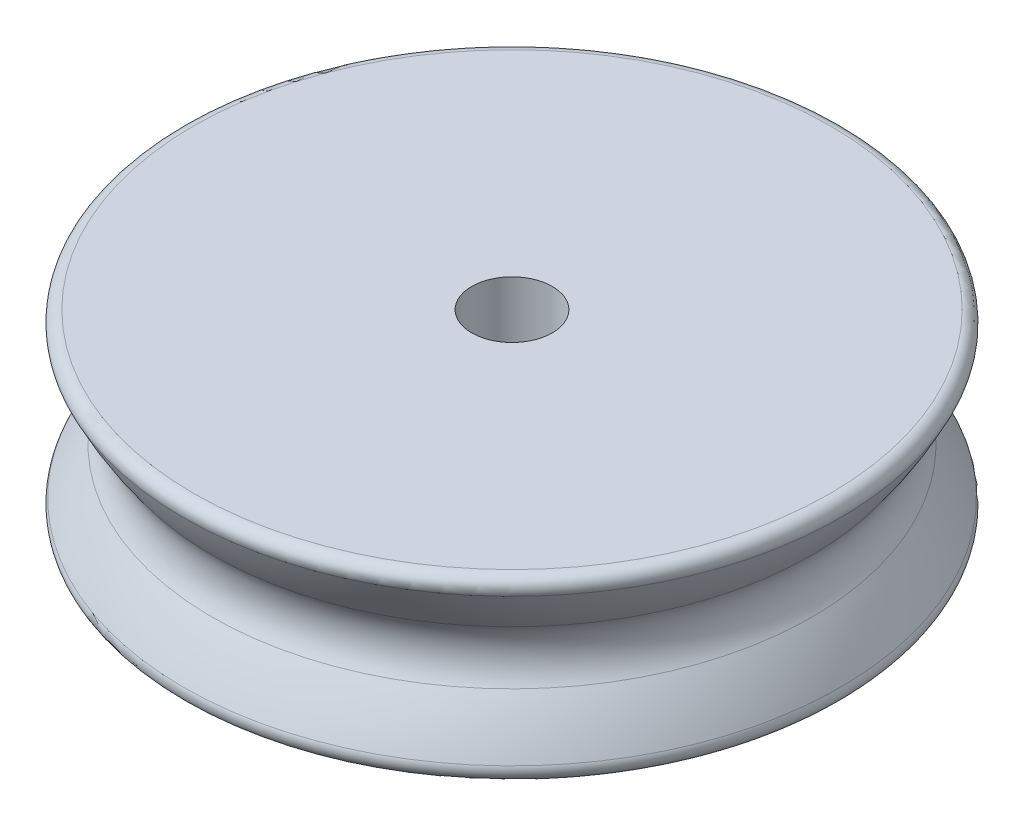
ISO-10303-21;
HEADER;
FILE_DESCRIPTION(('STEP AP214'),'2;1');
FILE_NAME('part.step','',(''),(''),'','','');
FILE_SCHEMA(('AUTOMOTIVE_DESIGN { 1 0 10303 214 1 1 1 1 }'));
ENDSEC;
DATA;
#1=APPLICATION_CONTEXT('core data for automotive mechanical design processes');
#2=APPLICATION_PROTOCOL_DEFINITION('international standard','automotive_design',2000,#1);
#3=PRODUCT_CONTEXT('',#1,'mechanical');
#4=PRODUCT('Part','Part','',(#3));
#5=PRODUCT_RELATED_PRODUCT_CATEGORY('part','',(#4));
#6=PRODUCT_DEFINITION_FORMATION('','',#4);
#7=PRODUCT_DEFINITION_CONTEXT('part definition',#1,'design');
#8=PRODUCT_DEFINITION('design','',#6,#7);
#9=PRODUCT_DEFINITION_SHAPE('','',#8);
#10=(LENGTH_UNIT() NAMED_UNIT(*) SI_UNIT(.MILLI.,.METRE.));
#11=(NAMED_UNIT(*) PLANE_ANGLE_UNIT() SI_UNIT($,.RADIAN.));
#12=(NAMED_UNIT(*) SI_UNIT($,.STERADIAN.) SOLID_ANGLE_UNIT());
#13=UNCERTAINTY_MEASURE_WITH_UNIT(LENGTH_MEASURE(1.E-05),#10,'distance_accuracy_value','');
#14=(GEOMETRIC_REPRESENTATION_CONTEXT(3) GLOBAL_UNCERTAINTY_ASSIGNED_CONTEXT((#13)) GLOBAL_UNIT_ASSIGNED_CONTEXT((#10,
#11,#12)) REPRESENTATION_CONTEXT('',''));
#15=CARTESIAN_POINT('',(0.,0.,0.));
#16=DIRECTION('',(0.,0.,1.));
#17=DIRECTION('',(1.,0.,0.));
#18=AXIS2_PLACEMENT_3D('',#15,#16,#17);
#19=CARTESIAN_POINT('',(2.286,5.08,0.));
#20=DIRECTION('',(0.,-1.,0.));
#21=DIRECTION('',(0.,0.,-1.));
#22=AXIS2_PLACEMENT_3D('',#19,#20,#21);
#23=PLANE('',#22);
#24=CARTESIAN_POINT('',(0.,5.08,0.));
#25=DIRECTION('',(0.,-1.,0.));
#26=DIRECTION('',(0.,0.,-1.));
#27=AXIS2_PLACEMENT_3D('',#24,#25,#26);
#28=CIRCLE('',#27,18.0657146436087);
#29=CARTESIAN_POINT('',(0.,5.08,-18.0657146436087));
#30=VERTEX_POINT('',#29);
#31=EDGE_CURVE('E47',#30,#30,#28,.F.);
#32=ORIENTED_EDGE('',*,*,#31,.T.);
#33=EDGE_LOOP('',(#32));
#34=FACE_BOUND('',#33,.T.);
#35=CARTESIAN_POINT('',(0.,5.08,0.));
#36=DIRECTION('',(0.,1.,0.));
#37=DIRECTION('',(0.,0.,1.));
#38=AXIS2_PLACEMENT_3D('',#35,#36,#37);
#39=CIRCLE('',#38,2.286);
#40=CARTESIAN_POINT('',(0.,5.08,2.286));
#41=VERTEX_POINT('',#40);
#42=EDGE_CURVE('E71',#41,#41,#39,.T.);
#43=ORIENTED_EDGE('',*,*,#42,.F.);
#44=EDGE_LOOP('',(#43));
#45=FACE_BOUND('',#44,.T.);
#46=ADVANCED_FACE('F39',(#34,#45),#23,.F.);
#47=CARTESIAN_POINT('',(0.,5.08,0.));
#48=DIRECTION('',(0.,1.,0.));
#49=DIRECTION('',(0.,0.,1.));
#50=AXIS2_PLACEMENT_3D('',#47,#48,#49);
#51=CYLINDRICAL_SURFACE('',#50,2.286);
#52=CARTESIAN_POINT('',(0.,-5.08,0.));
#53=DIRECTION('',(0.,1.,0.));
#54=DIRECTION('',(0.,0.,1.));
#55=AXIS2_PLACEMENT_3D('',#52,#53,#54);
#56=CIRCLE('',#55,2.286);
#57=CARTESIAN_POINT('',(0.,-5.08,2.286));
#58=VERTEX_POINT('',#57);
#59=EDGE_CURVE('E75',#58,#58,#56,.T.);
#60=ORIENTED_EDGE('',*,*,#59,.F.);
#61=EDGE_LOOP('',(#60));
#62=FACE_BOUND('',#61,.T.);
#63=ORIENTED_EDGE('',*,*,#42,.T.);
#64=EDGE_LOOP('',(#63));
#65=FACE_BOUND('',#64,.T.);
#66=ADVANCED_FACE('F82',(#62,#65),#51,.F.);
#67=CARTESIAN_POINT('',(2.286,-5.08,0.));
#68=DIRECTION('',(0.,1.,0.));
#69=DIRECTION('',(0.,0.,1.));
#70=AXIS2_PLACEMENT_3D('',#67,#68,#69);
#71=PLANE('',#70);
#72=CARTESIAN_POINT('',(0.,-5.08,0.));
#73=DIRECTION('',(0.,1.,0.));
#74=DIRECTION('',(0.,0.,1.));
#75=AXIS2_PLACEMENT_3D('',#72,#73,#74);
#76=CIRCLE('',#75,18.0657146436087);
#77=CARTESIAN_POINT('',(0.,-5.08,18.0657146436087));
#78=VERTEX_POINT('',#77);
#79=EDGE_CURVE('E52',#78,#78,#76,.F.);
#80=ORIENTED_EDGE('',*,*,#79,.T.);
#81=EDGE_LOOP('',(#80));
#82=FACE_BOUND('',#81,.T.);
#83=ORIENTED_EDGE('',*,*,#59,.T.);
#84=EDGE_LOOP('',(#83));
#85=FACE_BOUND('',#84,.T.);
#86=ADVANCED_FACE('F80',(#82,#85),#71,.F.);
#87=CARTESIAN_POINT('',(0.,0.,0.));
#88=DIRECTION('',(0.,1.,0.));
#89=DIRECTION('',(0.,0.,1.));
#90=AXIS2_PLACEMENT_3D('',#87,#88,#89);
#91=TOROIDAL_SURFACE('',#90,19.05,2.54);
#92=CARTESIAN_POINT('',(0.,-1.52400000000001,0.));
#93=DIRECTION('',(0.,1.,0.));
#94=DIRECTION('',(-1.,0.,0.));
#95=AXIS2_PLACEMENT_3D('',#92,#93,#94);
#96=CIRCLE('',#95,17.018);
#97=CARTESIAN_POINT('',(-17.018,-1.52400000000002,0.));
#98=VERTEX_POINT('',#97);
#99=EDGE_CURVE('E64',#98,#98,#96,.T.);
#100=ORIENTED_EDGE('',*,*,#99,.T.);
#101=EDGE_LOOP('',(#100));
#102=FACE_BOUND('',#101,.T.);
#103=CARTESIAN_POINT('',(0.,1.52399999999999,0.));
#104=DIRECTION('',(0.,-1.,0.));
#105=DIRECTION('',(1.,0.,0.));
#106=AXIS2_PLACEMENT_3D('',#103,#104,#105);
#107=CIRCLE('',#106,17.018);
#108=CARTESIAN_POINT('',(17.018,1.52399999999998,0.));
#109=VERTEX_POINT('',#108);
#110=EDGE_CURVE('E68',#109,#109,#107,.T.);
#111=ORIENTED_EDGE('',*,*,#110,.T.);
#112=EDGE_LOOP('',(#111));
#113=FACE_BOUND('',#112,.T.);
#114=ADVANCED_FACE('F98',(#102,#113),#91,.F.);
#115=CARTESIAN_POINT('',(0.,-11.43,0.));
#116=DIRECTION('',(0.,1.,0.));
#117=DIRECTION('',(-1.,0.,0.));
#118=AXIS2_PLACEMENT_3D('',#115,#116,#117);
#119=DEGENERATE_TOROIDAL_SURFACE('',#118,3.81000000000001,16.51,.T.);
#120=CARTESIAN_POINT('',(0.,-4.1656,0.));
#121=DIRECTION('',(0.,-1.,0.));
#122=DIRECTION('',(0.,0.,-1.));
#123=AXIS2_PLACEMENT_3D('',#120,#121,#122);
#124=CIRCLE('',#123,18.6359432293531);
#125=CARTESIAN_POINT('',(0.,-4.1656,-18.6359432293531));
#126=VERTEX_POINT('',#125);
#127=EDGE_CURVE('E58',#126,#126,#124,.F.);
#128=ORIENTED_EDGE('',*,*,#127,.T.);
#129=EDGE_LOOP('',(#128));
#130=FACE_BOUND('',#129,.T.);
#131=ORIENTED_EDGE('',*,*,#99,.F.);
#132=EDGE_LOOP('',(#131));
#133=FACE_BOUND('',#132,.T.);
#134=ADVANCED_FACE('F94',(#130,#133),#119,.T.);
#135=CARTESIAN_POINT('',(0.,11.43,0.));
#136=DIRECTION('',(0.,1.,0.));
#137=DIRECTION('',(-1.,0.,0.));
#138=AXIS2_PLACEMENT_3D('',#135,#136,#137);
#139=DEGENERATE_TOROIDAL_SURFACE('',#138,3.81000000000001,16.51,.T.);
#140=CARTESIAN_POINT('',(0.,4.1656,0.));
#141=DIRECTION('',(0.,1.,0.));
#142=DIRECTION('',(0.,0.,1.));
#143=AXIS2_PLACEMENT_3D('',#140,#141,#142);
#144=CIRCLE('',#143,18.6359432293531);
#145=CARTESIAN_POINT('',(0.,4.1656,18.6359432293531));
#146=VERTEX_POINT('',#145);
#147=EDGE_CURVE('E10',#146,#146,#144,.F.);
#148=ORIENTED_EDGE('',*,*,#147,.T.);
#149=EDGE_LOOP('',(#148));
#150=FACE_BOUND('',#149,.T.);
#151=ORIENTED_EDGE('',*,*,#110,.F.);
#152=EDGE_LOOP('',(#151));
#153=FACE_BOUND('',#152,.T.);
#154=ADVANCED_FACE('F97',(#150,#153),#139,.T.);
#155=CARTESIAN_POINT('',(0.,-4.445,0.));
#156=DIRECTION('',(0.,1.,0.));
#157=DIRECTION('',(0.,0.,1.));
#158=AXIS2_PLACEMENT_3D('',#155,#156,#157);
#159=TOROIDAL_SURFACE('',#158,18.0657146436087,0.635);
#160=ORIENTED_EDGE('',*,*,#79,.F.);
#161=EDGE_LOOP('',(#160));
#162=FACE_BOUND('',#161,.T.);
#163=ORIENTED_EDGE('',*,*,#127,.F.);
#164=EDGE_LOOP('',(#163));
#165=FACE_BOUND('',#164,.T.);
#166=ADVANCED_FACE('F101',(#162,#165),#159,.T.);
#167=CARTESIAN_POINT('',(0.,4.445,0.));
#168=DIRECTION('',(0.,-1.,0.));
#169=DIRECTION('',(0.,0.,-1.));
#170=AXIS2_PLACEMENT_3D('',#167,#168,#169);
#171=TOROIDAL_SURFACE('',#170,18.0657146436087,0.635);
#172=ORIENTED_EDGE('',*,*,#147,.F.);
#173=EDGE_LOOP('',(#172));
#174=FACE_BOUND('',#173,.T.);
#175=ORIENTED_EDGE('',*,*,#31,.F.);
#176=EDGE_LOOP('',(#175));
#177=FACE_BOUND('',#176,.T.);
#178=ADVANCED_FACE('F41',(#174,#177),#171,.T.);
#179=CLOSED_SHELL('',(#46,#66,#86,#114,#134,#154,#166,#178));
#180=MANIFOLD_SOLID_BREP('B2',#179);
#181=ADVANCED_BREP_SHAPE_REPRESENTATION('',(#18,#180),#14);
#182=SHAPE_DEFINITION_REPRESENTATION(#9,#181);
ENDSEC;
END-ISO-10303-21;
